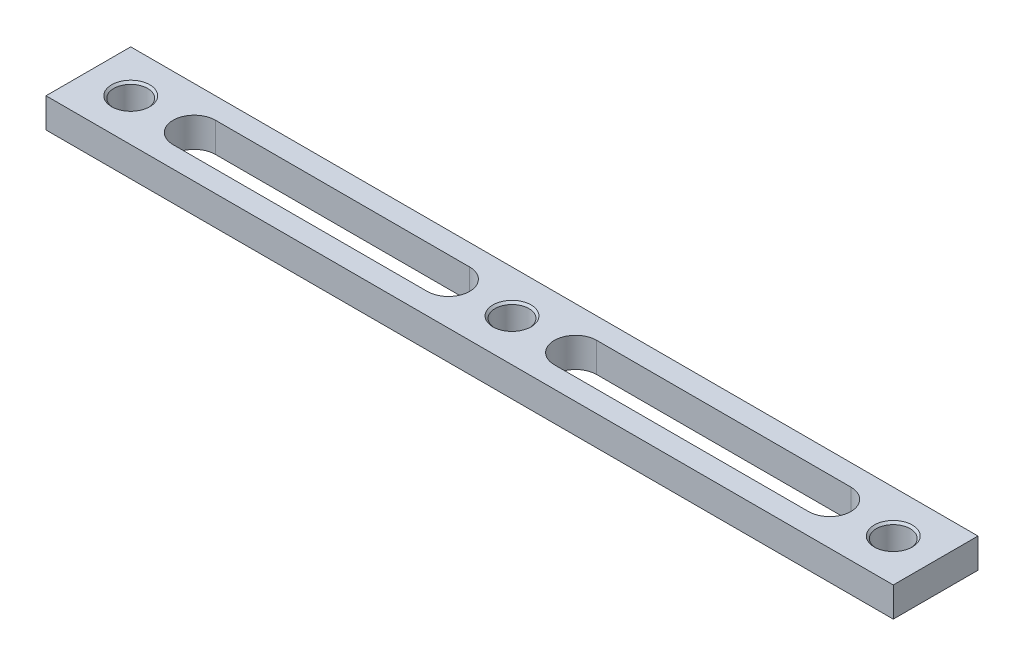
ISO-10303-21;
HEADER;
FILE_DESCRIPTION(('STEP AP214'),'2;1');
FILE_NAME('part.step','',(''),(''),'','','');
FILE_SCHEMA(('AUTOMOTIVE_DESIGN { 1 0 10303 214 1 1 1 1 }'));
ENDSEC;
DATA;
#1=APPLICATION_CONTEXT('core data for automotive mechanical design processes');
#2=APPLICATION_PROTOCOL_DEFINITION('international standard','automotive_design',2000,#1);
#3=PRODUCT_CONTEXT('',#1,'mechanical');
#4=PRODUCT('Part','Part','',(#3));
#5=PRODUCT_RELATED_PRODUCT_CATEGORY('part','',(#4));
#6=PRODUCT_DEFINITION_FORMATION('','',#4);
#7=PRODUCT_DEFINITION_CONTEXT('part definition',#1,'design');
#8=PRODUCT_DEFINITION('design','',#6,#7);
#9=PRODUCT_DEFINITION_SHAPE('','',#8);
#10=(LENGTH_UNIT() NAMED_UNIT(*) SI_UNIT(.MILLI.,.METRE.));
#11=(NAMED_UNIT(*) PLANE_ANGLE_UNIT() SI_UNIT($,.RADIAN.));
#12=(NAMED_UNIT(*) SI_UNIT($,.STERADIAN.) SOLID_ANGLE_UNIT());
#13=UNCERTAINTY_MEASURE_WITH_UNIT(LENGTH_MEASURE(1.E-05),#10,'distance_accuracy_value','');
#14=(GEOMETRIC_REPRESENTATION_CONTEXT(3) GLOBAL_UNCERTAINTY_ASSIGNED_CONTEXT((#13)) GLOBAL_UNIT_ASSIGNED_CONTEXT((#10,
#11,#12)) REPRESENTATION_CONTEXT('',''));
#15=CARTESIAN_POINT('',(0.,0.,0.));
#16=DIRECTION('',(0.,0.,1.));
#17=DIRECTION('',(1.,0.,0.));
#18=AXIS2_PLACEMENT_3D('',#15,#16,#17);
#19=CARTESIAN_POINT('',(0.,7.,0.));
#20=DIRECTION('',(0.,-1.,0.));
#21=DIRECTION('',(0.,0.,-1.));
#22=AXIS2_PLACEMENT_3D('',#19,#20,#21);
#23=PLANE('',#22);
#24=CARTESIAN_POINT('',(-75.,7.,0.));
#25=DIRECTION('',(0.,1.,0.));
#26=DIRECTION('',(0.,0.,1.));
#27=AXIS2_PLACEMENT_3D('',#24,#25,#26);
#28=CIRCLE('',#27,5.);
#29=CARTESIAN_POINT('',(-75.,7.,-5.));
#30=VERTEX_POINT('',#29);
#31=CARTESIAN_POINT('',(-75.,7.,5.));
#32=VERTEX_POINT('',#31);
#33=EDGE_CURVE('E184',#30,#32,#28,.T.);
#34=ORIENTED_EDGE('',*,*,#33,.F.);
#35=DIRECTION('',(-1.,0.,0.));
#36=VECTOR('',#35,1.);
#37=CARTESIAN_POINT('',(-75.,7.,-5.));
#38=LINE('',#37,#36);
#39=CARTESIAN_POINT('',(-15.,7.,-5.));
#40=VERTEX_POINT('',#39);
#41=EDGE_CURVE('E195',#40,#30,#38,.T.);
#42=ORIENTED_EDGE('',*,*,#41,.F.);
#43=CARTESIAN_POINT('',(-15.,7.,0.));
#44=DIRECTION('',(0.,1.,0.));
#45=DIRECTION('',(0.,0.,1.));
#46=AXIS2_PLACEMENT_3D('',#43,#44,#45);
#47=CIRCLE('',#46,5.);
#48=CARTESIAN_POINT('',(-15.,7.,5.));
#49=VERTEX_POINT('',#48);
#50=EDGE_CURVE('E191',#49,#40,#47,.T.);
#51=ORIENTED_EDGE('',*,*,#50,.F.);
#52=DIRECTION('',(1.,0.,0.));
#53=VECTOR('',#52,1.);
#54=CARTESIAN_POINT('',(-75.,7.,5.));
#55=LINE('',#54,#53);
#56=EDGE_CURVE('E187',#32,#49,#55,.T.);
#57=ORIENTED_EDGE('',*,*,#56,.F.);
#58=EDGE_LOOP('',(#34,#42,#51,#57));
#59=FACE_BOUND('',#58,.T.);
#60=DIRECTION('',(0.,0.,-1.));
#61=VECTOR('',#60,1.);
#62=CARTESIAN_POINT('',(100.,7.,10.));
#63=LINE('',#62,#61);
#64=CARTESIAN_POINT('',(100.,7.,10.));
#65=VERTEX_POINT('',#64);
#66=CARTESIAN_POINT('',(100.,7.,-10.));
#67=VERTEX_POINT('',#66);
#68=EDGE_CURVE('E227',#65,#67,#63,.T.);
#69=ORIENTED_EDGE('',*,*,#68,.T.);
#70=DIRECTION('',(-1.,0.,0.));
#71=VECTOR('',#70,1.);
#72=CARTESIAN_POINT('',(-100.,7.,-10.));
#73=LINE('',#72,#71);
#74=CARTESIAN_POINT('',(-100.,7.,-10.));
#75=VERTEX_POINT('',#74);
#76=EDGE_CURVE('E231',#67,#75,#73,.T.);
#77=ORIENTED_EDGE('',*,*,#76,.T.);
#78=DIRECTION('',(0.,0.,1.));
#79=VECTOR('',#78,1.);
#80=CARTESIAN_POINT('',(-100.,7.,10.));
#81=LINE('',#80,#79);
#82=CARTESIAN_POINT('',(-100.,7.,10.));
#83=VERTEX_POINT('',#82);
#84=EDGE_CURVE('E235',#75,#83,#81,.T.);
#85=ORIENTED_EDGE('',*,*,#84,.T.);
#86=DIRECTION('',(1.,0.,0.));
#87=VECTOR('',#86,1.);
#88=CARTESIAN_POINT('',(-100.,7.,10.));
#89=LINE('',#88,#87);
#90=EDGE_CURVE('E238',#83,#65,#89,.T.);
#91=ORIENTED_EDGE('',*,*,#90,.T.);
#92=EDGE_LOOP('',(#69,#77,#85,#91));
#93=FACE_BOUND('',#92,.T.);
#94=CARTESIAN_POINT('',(75.,7.,0.));
#95=DIRECTION('',(0.,1.,0.));
#96=DIRECTION('',(0.,0.,-1.));
#97=AXIS2_PLACEMENT_3D('',#94,#95,#96);
#98=CIRCLE('',#97,5.);
#99=CARTESIAN_POINT('',(75.,7.,5.));
#100=VERTEX_POINT('',#99);
#101=CARTESIAN_POINT('',(75.,7.,-5.));
#102=VERTEX_POINT('',#101);
#103=EDGE_CURVE('E133',#100,#102,#98,.T.);
#104=ORIENTED_EDGE('',*,*,#103,.F.);
#105=DIRECTION('',(1.,0.,0.));
#106=VECTOR('',#105,1.);
#107=CARTESIAN_POINT('',(75.,7.,5.));
#108=LINE('',#107,#106);
#109=CARTESIAN_POINT('',(15.,7.,5.));
#110=VERTEX_POINT('',#109);
#111=EDGE_CURVE('E160',#110,#100,#108,.T.);
#112=ORIENTED_EDGE('',*,*,#111,.F.);
#113=CARTESIAN_POINT('',(15.,7.,0.));
#114=DIRECTION('',(0.,1.,0.));
#115=DIRECTION('',(0.,0.,-1.));
#116=AXIS2_PLACEMENT_3D('',#113,#114,#115);
#117=CIRCLE('',#116,5.);
#118=CARTESIAN_POINT('',(15.,7.,-5.));
#119=VERTEX_POINT('',#118);
#120=EDGE_CURVE('E156',#119,#110,#117,.T.);
#121=ORIENTED_EDGE('',*,*,#120,.F.);
#122=DIRECTION('',(-1.,0.,0.));
#123=VECTOR('',#122,1.);
#124=CARTESIAN_POINT('',(75.,7.,-5.));
#125=LINE('',#124,#123);
#126=EDGE_CURVE('E142',#102,#119,#125,.T.);
#127=ORIENTED_EDGE('',*,*,#126,.F.);
#128=EDGE_LOOP('',(#104,#112,#121,#127));
#129=FACE_BOUND('',#128,.T.);
#130=CARTESIAN_POINT('',(90.,7.,0.));
#131=DIRECTION('',(0.,1.,0.));
#132=DIRECTION('',(0.,0.,1.));
#133=AXIS2_PLACEMENT_3D('',#130,#131,#132);
#134=CIRCLE('',#133,4.5);
#135=CARTESIAN_POINT('',(90.,7.,4.5));
#136=VERTEX_POINT('',#135);
#137=EDGE_CURVE('E420',#136,#136,#134,.T.);
#138=ORIENTED_EDGE('',*,*,#137,.F.);
#139=EDGE_LOOP('',(#138));
#140=FACE_BOUND('',#139,.T.);
#141=CARTESIAN_POINT('',(0.,7.,0.));
#142=DIRECTION('',(0.,1.,0.));
#143=DIRECTION('',(0.,0.,1.));
#144=AXIS2_PLACEMENT_3D('',#141,#142,#143);
#145=CIRCLE('',#144,4.5);
#146=CARTESIAN_POINT('',(0.,7.,4.5));
#147=VERTEX_POINT('',#146);
#148=EDGE_CURVE('E404',#147,#147,#145,.T.);
#149=ORIENTED_EDGE('',*,*,#148,.F.);
#150=EDGE_LOOP('',(#149));
#151=FACE_BOUND('',#150,.T.);
#152=CARTESIAN_POINT('',(-90.,7.,0.));
#153=DIRECTION('',(0.,1.,0.));
#154=DIRECTION('',(0.,0.,1.));
#155=AXIS2_PLACEMENT_3D('',#152,#153,#154);
#156=CIRCLE('',#155,4.5);
#157=CARTESIAN_POINT('',(-90.,7.,4.5));
#158=VERTEX_POINT('',#157);
#159=EDGE_CURVE('E385',#158,#158,#156,.T.);
#160=ORIENTED_EDGE('',*,*,#159,.F.);
#161=EDGE_LOOP('',(#160));
#162=FACE_BOUND('',#161,.T.);
#163=ADVANCED_FACE('F43',(#59,#93,#129,#140,#151,#162),#23,.F.);
#164=CARTESIAN_POINT('',(0.,0.,0.));
#165=DIRECTION('',(0.,-1.,0.));
#166=DIRECTION('',(0.,0.,-1.));
#167=AXIS2_PLACEMENT_3D('',#164,#165,#166);
#168=PLANE('',#167);
#169=CARTESIAN_POINT('',(-90.,0.,0.));
#170=DIRECTION('',(0.,1.,0.));
#171=DIRECTION('',(0.,0.,1.));
#172=AXIS2_PLACEMENT_3D('',#169,#170,#171);
#173=CIRCLE('',#172,4.5);
#174=CARTESIAN_POINT('',(-90.,0.,4.5));
#175=VERTEX_POINT('',#174);
#176=EDGE_CURVE('E388',#175,#175,#173,.T.);
#177=ORIENTED_EDGE('',*,*,#176,.T.);
#178=EDGE_LOOP('',(#177));
#179=FACE_BOUND('',#178,.T.);
#180=CARTESIAN_POINT('',(0.,0.,0.));
#181=DIRECTION('',(0.,1.,0.));
#182=DIRECTION('',(0.,0.,1.));
#183=AXIS2_PLACEMENT_3D('',#180,#181,#182);
#184=CIRCLE('',#183,4.5);
#185=CARTESIAN_POINT('',(0.,0.,4.5));
#186=VERTEX_POINT('',#185);
#187=EDGE_CURVE('E400',#186,#186,#184,.T.);
#188=ORIENTED_EDGE('',*,*,#187,.T.);
#189=EDGE_LOOP('',(#188));
#190=FACE_BOUND('',#189,.T.);
#191=CARTESIAN_POINT('',(90.,0.,0.));
#192=DIRECTION('',(0.,1.,0.));
#193=DIRECTION('',(0.,0.,1.));
#194=AXIS2_PLACEMENT_3D('',#191,#192,#193);
#195=CIRCLE('',#194,4.5);
#196=CARTESIAN_POINT('',(90.,0.,4.5));
#197=VERTEX_POINT('',#196);
#198=EDGE_CURVE('E416',#197,#197,#195,.T.);
#199=ORIENTED_EDGE('',*,*,#198,.T.);
#200=EDGE_LOOP('',(#199));
#201=FACE_BOUND('',#200,.T.);
#202=DIRECTION('',(0.,0.,-1.));
#203=VECTOR('',#202,1.);
#204=CARTESIAN_POINT('',(100.,0.,10.));
#205=LINE('',#204,#203);
#206=CARTESIAN_POINT('',(100.,0.,10.));
#207=VERTEX_POINT('',#206);
#208=CARTESIAN_POINT('',(100.,0.,-10.));
#209=VERTEX_POINT('',#208);
#210=EDGE_CURVE('E226',#207,#209,#205,.T.);
#211=ORIENTED_EDGE('',*,*,#210,.F.);
#212=DIRECTION('',(1.,0.,0.));
#213=VECTOR('',#212,1.);
#214=CARTESIAN_POINT('',(-100.,0.,10.));
#215=LINE('',#214,#213);
#216=CARTESIAN_POINT('',(-100.,0.,10.));
#217=VERTEX_POINT('',#216);
#218=EDGE_CURVE('E232',#217,#207,#215,.T.);
#219=ORIENTED_EDGE('',*,*,#218,.F.);
#220=DIRECTION('',(0.,0.,1.));
#221=VECTOR('',#220,1.);
#222=CARTESIAN_POINT('',(-100.,0.,10.));
#223=LINE('',#222,#221);
#224=CARTESIAN_POINT('',(-100.,0.,-10.));
#225=VERTEX_POINT('',#224);
#226=EDGE_CURVE('E248',#225,#217,#223,.T.);
#227=ORIENTED_EDGE('',*,*,#226,.F.);
#228=DIRECTION('',(-1.,0.,0.));
#229=VECTOR('',#228,1.);
#230=CARTESIAN_POINT('',(-100.,0.,-10.));
#231=LINE('',#230,#229);
#232=EDGE_CURVE('E245',#209,#225,#231,.T.);
#233=ORIENTED_EDGE('',*,*,#232,.F.);
#234=EDGE_LOOP('',(#211,#219,#227,#233));
#235=FACE_BOUND('',#234,.T.);
#236=DIRECTION('',(-1.,0.,0.));
#237=VECTOR('',#236,1.);
#238=CARTESIAN_POINT('',(-75.,0.,-5.));
#239=LINE('',#238,#237);
#240=CARTESIAN_POINT('',(-15.,0.,-5.));
#241=VERTEX_POINT('',#240);
#242=CARTESIAN_POINT('',(-75.,0.,-5.));
#243=VERTEX_POINT('',#242);
#244=EDGE_CURVE('E188',#241,#243,#239,.T.);
#245=ORIENTED_EDGE('',*,*,#244,.T.);
#246=CARTESIAN_POINT('',(-75.,0.,0.));
#247=DIRECTION('',(0.,1.,0.));
#248=DIRECTION('',(0.,0.,1.));
#249=AXIS2_PLACEMENT_3D('',#246,#247,#248);
#250=CIRCLE('',#249,5.);
#251=CARTESIAN_POINT('',(-75.,0.,5.));
#252=VERTEX_POINT('',#251);
#253=EDGE_CURVE('E151',#243,#252,#250,.T.);
#254=ORIENTED_EDGE('',*,*,#253,.T.);
#255=DIRECTION('',(1.,0.,0.));
#256=VECTOR('',#255,1.);
#257=CARTESIAN_POINT('',(-75.,0.,5.));
#258=LINE('',#257,#256);
#259=CARTESIAN_POINT('',(-15.,0.,5.));
#260=VERTEX_POINT('',#259);
#261=EDGE_CURVE('E202',#252,#260,#258,.T.);
#262=ORIENTED_EDGE('',*,*,#261,.T.);
#263=CARTESIAN_POINT('',(-15.,0.,0.));
#264=DIRECTION('',(0.,1.,0.));
#265=DIRECTION('',(0.,0.,1.));
#266=AXIS2_PLACEMENT_3D('',#263,#264,#265);
#267=CIRCLE('',#266,5.);
#268=EDGE_CURVE('E206',#260,#241,#267,.T.);
#269=ORIENTED_EDGE('',*,*,#268,.T.);
#270=EDGE_LOOP('',(#245,#254,#262,#269));
#271=FACE_BOUND('',#270,.T.);
#272=DIRECTION('',(1.,0.,0.));
#273=VECTOR('',#272,1.);
#274=CARTESIAN_POINT('',(75.,0.,5.));
#275=LINE('',#274,#273);
#276=CARTESIAN_POINT('',(15.,0.,5.));
#277=VERTEX_POINT('',#276);
#278=CARTESIAN_POINT('',(75.,0.,5.));
#279=VERTEX_POINT('',#278);
#280=EDGE_CURVE('E143',#277,#279,#275,.T.);
#281=ORIENTED_EDGE('',*,*,#280,.T.);
#282=CARTESIAN_POINT('',(75.,0.,0.));
#283=DIRECTION('',(0.,1.,0.));
#284=DIRECTION('',(0.,0.,-1.));
#285=AXIS2_PLACEMENT_3D('',#282,#283,#284);
#286=CIRCLE('',#285,5.);
#287=CARTESIAN_POINT('',(75.,0.,-5.));
#288=VERTEX_POINT('',#287);
#289=EDGE_CURVE('E67',#279,#288,#286,.T.);
#290=ORIENTED_EDGE('',*,*,#289,.T.);
#291=DIRECTION('',(-1.,0.,0.));
#292=VECTOR('',#291,1.);
#293=CARTESIAN_POINT('',(75.,0.,-5.));
#294=LINE('',#293,#292);
#295=CARTESIAN_POINT('',(15.,0.,-5.));
#296=VERTEX_POINT('',#295);
#297=EDGE_CURVE('E149',#288,#296,#294,.T.);
#298=ORIENTED_EDGE('',*,*,#297,.T.);
#299=CARTESIAN_POINT('',(15.,0.,0.));
#300=DIRECTION('',(0.,1.,0.));
#301=DIRECTION('',(0.,0.,-1.));
#302=AXIS2_PLACEMENT_3D('',#299,#300,#301);
#303=CIRCLE('',#302,5.);
#304=EDGE_CURVE('E171',#296,#277,#303,.T.);
#305=ORIENTED_EDGE('',*,*,#304,.T.);
#306=EDGE_LOOP('',(#281,#290,#298,#305));
#307=FACE_BOUND('',#306,.T.);
#308=ADVANCED_FACE('F271',(#179,#190,#201,#235,#271,#307),#168,.T.);
#309=CARTESIAN_POINT('',(100.,7.,10.));
#310=DIRECTION('',(-1.,0.,0.));
#311=DIRECTION('',(0.,0.,1.));
#312=AXIS2_PLACEMENT_3D('',#309,#310,#311);
#313=PLANE('',#312);
#314=ORIENTED_EDGE('',*,*,#210,.T.);
#315=DIRECTION('',(0.,-1.,0.));
#316=VECTOR('',#315,1.);
#317=CARTESIAN_POINT('',(100.,7.,-10.));
#318=LINE('',#317,#316);
#319=EDGE_CURVE('E11',#67,#209,#318,.T.);
#320=ORIENTED_EDGE('',*,*,#319,.F.);
#321=ORIENTED_EDGE('',*,*,#68,.F.);
#322=DIRECTION('',(0.,-1.,0.));
#323=VECTOR('',#322,1.);
#324=CARTESIAN_POINT('',(100.,7.,10.));
#325=LINE('',#324,#323);
#326=EDGE_CURVE('E241',#65,#207,#325,.T.);
#327=ORIENTED_EDGE('',*,*,#326,.T.);
#328=EDGE_LOOP('',(#314,#320,#321,#327));
#329=FACE_BOUND('',#328,.T.);
#330=ADVANCED_FACE('F45',(#329),#313,.F.);
#331=CARTESIAN_POINT('',(-100.,7.,-10.));
#332=DIRECTION('',(0.,0.,1.));
#333=DIRECTION('',(1.,0.,0.));
#334=AXIS2_PLACEMENT_3D('',#331,#332,#333);
#335=PLANE('',#334);
#336=ORIENTED_EDGE('',*,*,#232,.T.);
#337=DIRECTION('',(0.,-1.,0.));
#338=VECTOR('',#337,1.);
#339=CARTESIAN_POINT('',(-100.,7.,-10.));
#340=LINE('',#339,#338);
#341=EDGE_CURVE('E52',#75,#225,#340,.T.);
#342=ORIENTED_EDGE('',*,*,#341,.F.);
#343=ORIENTED_EDGE('',*,*,#76,.F.);
#344=ORIENTED_EDGE('',*,*,#319,.T.);
#345=EDGE_LOOP('',(#336,#342,#343,#344));
#346=FACE_BOUND('',#345,.T.);
#347=ADVANCED_FACE('F281',(#346),#335,.F.);
#348=CARTESIAN_POINT('',(-100.,7.,10.));
#349=DIRECTION('',(1.,0.,0.));
#350=DIRECTION('',(0.,0.,-1.));
#351=AXIS2_PLACEMENT_3D('',#348,#349,#350);
#352=PLANE('',#351);
#353=ORIENTED_EDGE('',*,*,#226,.T.);
#354=DIRECTION('',(0.,-1.,0.));
#355=VECTOR('',#354,1.);
#356=CARTESIAN_POINT('',(-100.,7.,10.));
#357=LINE('',#356,#355);
#358=EDGE_CURVE('E256',#83,#217,#357,.T.);
#359=ORIENTED_EDGE('',*,*,#358,.F.);
#360=ORIENTED_EDGE('',*,*,#84,.F.);
#361=ORIENTED_EDGE('',*,*,#341,.T.);
#362=EDGE_LOOP('',(#353,#359,#360,#361));
#363=FACE_BOUND('',#362,.T.);
#364=ADVANCED_FACE('F265',(#363),#352,.F.);
#365=CARTESIAN_POINT('',(-100.,7.,10.));
#366=DIRECTION('',(0.,0.,-1.));
#367=DIRECTION('',(-1.,0.,0.));
#368=AXIS2_PLACEMENT_3D('',#365,#366,#367);
#369=PLANE('',#368);
#370=ORIENTED_EDGE('',*,*,#218,.T.);
#371=ORIENTED_EDGE('',*,*,#326,.F.);
#372=ORIENTED_EDGE('',*,*,#90,.F.);
#373=ORIENTED_EDGE('',*,*,#358,.T.);
#374=EDGE_LOOP('',(#370,#371,#372,#373));
#375=FACE_BOUND('',#374,.T.);
#376=ADVANCED_FACE('F275',(#375),#369,.F.);
#377=CARTESIAN_POINT('',(-75.,7.,0.));
#378=DIRECTION('',(0.,-1.,0.));
#379=DIRECTION('',(0.,0.,-1.));
#380=AXIS2_PLACEMENT_3D('',#377,#378,#379);
#381=CYLINDRICAL_SURFACE('',#380,5.);
#382=ORIENTED_EDGE('',*,*,#253,.F.);
#383=DIRECTION('',(0.,-1.,0.));
#384=VECTOR('',#383,1.);
#385=CARTESIAN_POINT('',(-75.,7.,-5.));
#386=LINE('',#385,#384);
#387=EDGE_CURVE('E198',#30,#243,#386,.T.);
#388=ORIENTED_EDGE('',*,*,#387,.F.);
#389=ORIENTED_EDGE('',*,*,#33,.T.);
#390=DIRECTION('',(0.,-1.,0.));
#391=VECTOR('',#390,1.);
#392=CARTESIAN_POINT('',(-75.,7.,5.));
#393=LINE('',#392,#391);
#394=EDGE_CURVE('E222',#32,#252,#393,.T.);
#395=ORIENTED_EDGE('',*,*,#394,.T.);
#396=EDGE_LOOP('',(#382,#388,#389,#395));
#397=FACE_BOUND('',#396,.T.);
#398=ADVANCED_FACE('F298',(#397),#381,.F.);
#399=CARTESIAN_POINT('',(-75.,7.,5.));
#400=DIRECTION('',(0.,0.,-1.));
#401=DIRECTION('',(-1.,0.,0.));
#402=AXIS2_PLACEMENT_3D('',#399,#400,#401);
#403=PLANE('',#402);
#404=ORIENTED_EDGE('',*,*,#261,.F.);
#405=ORIENTED_EDGE('',*,*,#394,.F.);
#406=ORIENTED_EDGE('',*,*,#56,.T.);
#407=DIRECTION('',(0.,-1.,0.));
#408=VECTOR('',#407,1.);
#409=CARTESIAN_POINT('',(-15.,7.,5.));
#410=LINE('',#409,#408);
#411=EDGE_CURVE('E219',#49,#260,#410,.T.);
#412=ORIENTED_EDGE('',*,*,#411,.T.);
#413=EDGE_LOOP('',(#404,#405,#406,#412));
#414=FACE_BOUND('',#413,.T.);
#415=ADVANCED_FACE('F305',(#414),#403,.T.);
#416=CARTESIAN_POINT('',(-15.,7.,0.));
#417=DIRECTION('',(0.,-1.,0.));
#418=DIRECTION('',(0.,0.,-1.));
#419=AXIS2_PLACEMENT_3D('',#416,#417,#418);
#420=CYLINDRICAL_SURFACE('',#419,5.);
#421=ORIENTED_EDGE('',*,*,#268,.F.);
#422=ORIENTED_EDGE('',*,*,#411,.F.);
#423=ORIENTED_EDGE('',*,*,#50,.T.);
#424=DIRECTION('',(0.,-1.,0.));
#425=VECTOR('',#424,1.);
#426=CARTESIAN_POINT('',(-15.,7.,-5.));
#427=LINE('',#426,#425);
#428=EDGE_CURVE('E216',#40,#241,#427,.T.);
#429=ORIENTED_EDGE('',*,*,#428,.T.);
#430=EDGE_LOOP('',(#421,#422,#423,#429));
#431=FACE_BOUND('',#430,.T.);
#432=ADVANCED_FACE('F310',(#431),#420,.F.);
#433=CARTESIAN_POINT('',(-75.,7.,-5.));
#434=DIRECTION('',(0.,0.,1.));
#435=DIRECTION('',(1.,0.,0.));
#436=AXIS2_PLACEMENT_3D('',#433,#434,#435);
#437=PLANE('',#436);
#438=ORIENTED_EDGE('',*,*,#244,.F.);
#439=ORIENTED_EDGE('',*,*,#428,.F.);
#440=ORIENTED_EDGE('',*,*,#41,.T.);
#441=ORIENTED_EDGE('',*,*,#387,.T.);
#442=EDGE_LOOP('',(#438,#439,#440,#441));
#443=FACE_BOUND('',#442,.T.);
#444=ADVANCED_FACE('F316',(#443),#437,.T.);
#445=CARTESIAN_POINT('',(75.,7.,0.));
#446=DIRECTION('',(0.,-1.,0.));
#447=DIRECTION('',(0.,0.,-1.));
#448=AXIS2_PLACEMENT_3D('',#445,#446,#447);
#449=CYLINDRICAL_SURFACE('',#448,5.);
#450=ORIENTED_EDGE('',*,*,#289,.F.);
#451=DIRECTION('',(0.,-1.,0.));
#452=VECTOR('',#451,1.);
#453=CARTESIAN_POINT('',(75.,7.,5.));
#454=LINE('',#453,#452);
#455=EDGE_CURVE('E137',#100,#279,#454,.T.);
#456=ORIENTED_EDGE('',*,*,#455,.F.);
#457=ORIENTED_EDGE('',*,*,#103,.T.);
#458=DIRECTION('',(0.,-1.,0.));
#459=VECTOR('',#458,1.);
#460=CARTESIAN_POINT('',(75.,7.,-5.));
#461=LINE('',#460,#459);
#462=EDGE_CURVE('E136',#102,#288,#461,.T.);
#463=ORIENTED_EDGE('',*,*,#462,.T.);
#464=EDGE_LOOP('',(#450,#456,#457,#463));
#465=FACE_BOUND('',#464,.T.);
#466=ADVANCED_FACE('F135',(#465),#449,.F.);
#467=CARTESIAN_POINT('',(75.,7.,-5.));
#468=DIRECTION('',(0.,0.,1.));
#469=DIRECTION('',(1.,0.,0.));
#470=AXIS2_PLACEMENT_3D('',#467,#468,#469);
#471=PLANE('',#470);
#472=ORIENTED_EDGE('',*,*,#297,.F.);
#473=ORIENTED_EDGE('',*,*,#462,.F.);
#474=ORIENTED_EDGE('',*,*,#126,.T.);
#475=DIRECTION('',(0.,-1.,0.));
#476=VECTOR('',#475,1.);
#477=CARTESIAN_POINT('',(15.,7.,-5.));
#478=LINE('',#477,#476);
#479=EDGE_CURVE('E152',#119,#296,#478,.T.);
#480=ORIENTED_EDGE('',*,*,#479,.T.);
#481=EDGE_LOOP('',(#472,#473,#474,#480));
#482=FACE_BOUND('',#481,.T.);
#483=ADVANCED_FACE('F146',(#482),#471,.T.);
#484=CARTESIAN_POINT('',(15.,7.,0.));
#485=DIRECTION('',(0.,-1.,0.));
#486=DIRECTION('',(0.,0.,-1.));
#487=AXIS2_PLACEMENT_3D('',#484,#485,#486);
#488=CYLINDRICAL_SURFACE('',#487,5.);
#489=ORIENTED_EDGE('',*,*,#304,.F.);
#490=ORIENTED_EDGE('',*,*,#479,.F.);
#491=ORIENTED_EDGE('',*,*,#120,.T.);
#492=DIRECTION('',(0.,-1.,0.));
#493=VECTOR('',#492,1.);
#494=CARTESIAN_POINT('',(15.,7.,5.));
#495=LINE('',#494,#493);
#496=EDGE_CURVE('E59',#110,#277,#495,.T.);
#497=ORIENTED_EDGE('',*,*,#496,.T.);
#498=EDGE_LOOP('',(#489,#490,#491,#497));
#499=FACE_BOUND('',#498,.T.);
#500=ADVANCED_FACE('F335',(#499),#488,.F.);
#501=CARTESIAN_POINT('',(75.,7.,5.));
#502=DIRECTION('',(0.,0.,-1.));
#503=DIRECTION('',(-1.,0.,0.));
#504=AXIS2_PLACEMENT_3D('',#501,#502,#503);
#505=PLANE('',#504);
#506=ORIENTED_EDGE('',*,*,#280,.F.);
#507=ORIENTED_EDGE('',*,*,#496,.F.);
#508=ORIENTED_EDGE('',*,*,#111,.T.);
#509=ORIENTED_EDGE('',*,*,#455,.T.);
#510=EDGE_LOOP('',(#506,#507,#508,#509));
#511=FACE_BOUND('',#510,.T.);
#512=ADVANCED_FACE('F338',(#511),#505,.T.);
#513=CARTESIAN_POINT('',(90.,0.500000000000003,0.));
#514=DIRECTION('',(0.,-1.,0.));
#515=DIRECTION('',(0.,0.,-1.));
#516=AXIS2_PLACEMENT_3D('',#513,#514,#515);
#517=CONICAL_SURFACE('',#516,4.,0.785398163397447);
#518=ORIENTED_EDGE('',*,*,#198,.F.);
#519=EDGE_LOOP('',(#518));
#520=FACE_BOUND('',#519,.T.);
#521=CARTESIAN_POINT('',(90.,0.500000000000003,0.));
#522=DIRECTION('',(0.,1.,0.));
#523=DIRECTION('',(0.,0.,1.));
#524=AXIS2_PLACEMENT_3D('',#521,#522,#523);
#525=CIRCLE('',#524,4.);
#526=CARTESIAN_POINT('',(90.,0.500000000000003,4.));
#527=VERTEX_POINT('',#526);
#528=EDGE_CURVE('E168',#527,#527,#525,.T.);
#529=ORIENTED_EDGE('',*,*,#528,.T.);
#530=EDGE_LOOP('',(#529));
#531=FACE_BOUND('',#530,.T.);
#532=ADVANCED_FACE('F342',(#520,#531),#517,.F.);
#533=CARTESIAN_POINT('',(90.,7.,0.));
#534=DIRECTION('',(0.,1.,0.));
#535=DIRECTION('',(0.,0.,1.));
#536=AXIS2_PLACEMENT_3D('',#533,#534,#535);
#537=CYLINDRICAL_SURFACE('',#536,4.);
#538=ORIENTED_EDGE('',*,*,#528,.F.);
#539=EDGE_LOOP('',(#538));
#540=FACE_BOUND('',#539,.T.);
#541=CARTESIAN_POINT('',(90.,6.5,0.));
#542=DIRECTION('',(0.,1.,0.));
#543=DIRECTION('',(0.,0.,1.));
#544=AXIS2_PLACEMENT_3D('',#541,#542,#543);
#545=CIRCLE('',#544,4.);
#546=CARTESIAN_POINT('',(90.,6.5,4.));
#547=VERTEX_POINT('',#546);
#548=EDGE_CURVE('E424',#547,#547,#545,.T.);
#549=ORIENTED_EDGE('',*,*,#548,.T.);
#550=EDGE_LOOP('',(#549));
#551=FACE_BOUND('',#550,.T.);
#552=ADVANCED_FACE('F345',(#540,#551),#537,.F.);
#553=CARTESIAN_POINT('',(90.,7.,0.));
#554=DIRECTION('',(0.,1.,0.));
#555=DIRECTION('',(0.,0.,1.));
#556=AXIS2_PLACEMENT_3D('',#553,#554,#555);
#557=CONICAL_SURFACE('',#556,4.5,0.785398163397448);
#558=ORIENTED_EDGE('',*,*,#548,.F.);
#559=EDGE_LOOP('',(#558));
#560=FACE_BOUND('',#559,.T.);
#561=ORIENTED_EDGE('',*,*,#137,.T.);
#562=EDGE_LOOP('',(#561));
#563=FACE_BOUND('',#562,.T.);
#564=ADVANCED_FACE('F349',(#560,#563),#557,.F.);
#565=CARTESIAN_POINT('',(0.,0.500000000000003,0.));
#566=DIRECTION('',(0.,-1.,0.));
#567=DIRECTION('',(0.,0.,-1.));
#568=AXIS2_PLACEMENT_3D('',#565,#566,#567);
#569=CONICAL_SURFACE('',#568,4.,0.785398163397447);
#570=ORIENTED_EDGE('',*,*,#187,.F.);
#571=EDGE_LOOP('',(#570));
#572=FACE_BOUND('',#571,.T.);
#573=CARTESIAN_POINT('',(0.,0.500000000000003,0.));
#574=DIRECTION('',(0.,1.,0.));
#575=DIRECTION('',(0.,0.,1.));
#576=AXIS2_PLACEMENT_3D('',#573,#574,#575);
#577=CIRCLE('',#576,4.);
#578=CARTESIAN_POINT('',(0.,0.500000000000003,4.));
#579=VERTEX_POINT('',#578);
#580=EDGE_CURVE('E412',#579,#579,#577,.T.);
#581=ORIENTED_EDGE('',*,*,#580,.T.);
#582=EDGE_LOOP('',(#581));
#583=FACE_BOUND('',#582,.T.);
#584=ADVANCED_FACE('F353',(#572,#583),#569,.F.);
#585=CARTESIAN_POINT('',(0.,7.,0.));
#586=DIRECTION('',(0.,1.,0.));
#587=DIRECTION('',(0.,0.,1.));
#588=AXIS2_PLACEMENT_3D('',#585,#586,#587);
#589=CYLINDRICAL_SURFACE('',#588,4.);
#590=ORIENTED_EDGE('',*,*,#580,.F.);
#591=EDGE_LOOP('',(#590));
#592=FACE_BOUND('',#591,.T.);
#593=CARTESIAN_POINT('',(0.,6.5,0.));
#594=DIRECTION('',(0.,1.,0.));
#595=DIRECTION('',(0.,0.,1.));
#596=AXIS2_PLACEMENT_3D('',#593,#594,#595);
#597=CIRCLE('',#596,4.);
#598=CARTESIAN_POINT('',(0.,6.5,4.));
#599=VERTEX_POINT('',#598);
#600=EDGE_CURVE('E408',#599,#599,#597,.T.);
#601=ORIENTED_EDGE('',*,*,#600,.T.);
#602=EDGE_LOOP('',(#601));
#603=FACE_BOUND('',#602,.T.);
#604=ADVANCED_FACE('F357',(#592,#603),#589,.F.);
#605=CARTESIAN_POINT('',(0.,7.,0.));
#606=DIRECTION('',(0.,1.,0.));
#607=DIRECTION('',(0.,0.,1.));
#608=AXIS2_PLACEMENT_3D('',#605,#606,#607);
#609=CONICAL_SURFACE('',#608,4.5,0.78539816339745);
#610=ORIENTED_EDGE('',*,*,#600,.F.);
#611=EDGE_LOOP('',(#610));
#612=FACE_BOUND('',#611,.T.);
#613=ORIENTED_EDGE('',*,*,#148,.T.);
#614=EDGE_LOOP('',(#613));
#615=FACE_BOUND('',#614,.T.);
#616=ADVANCED_FACE('F361',(#612,#615),#609,.F.);
#617=CARTESIAN_POINT('',(-90.,0.500000000000003,0.));
#618=DIRECTION('',(0.,-1.,0.));
#619=DIRECTION('',(0.,0.,-1.));
#620=AXIS2_PLACEMENT_3D('',#617,#618,#619);
#621=CONICAL_SURFACE('',#620,4.,0.785398163397447);
#622=ORIENTED_EDGE('',*,*,#176,.F.);
#623=EDGE_LOOP('',(#622));
#624=FACE_BOUND('',#623,.T.);
#625=CARTESIAN_POINT('',(-90.,0.500000000000003,0.));
#626=DIRECTION('',(0.,1.,0.));
#627=DIRECTION('',(0.,0.,1.));
#628=AXIS2_PLACEMENT_3D('',#625,#626,#627);
#629=CIRCLE('',#628,4.);
#630=CARTESIAN_POINT('',(-90.,0.500000000000003,4.));
#631=VERTEX_POINT('',#630);
#632=EDGE_CURVE('E392',#631,#631,#629,.T.);
#633=ORIENTED_EDGE('',*,*,#632,.T.);
#634=EDGE_LOOP('',(#633));
#635=FACE_BOUND('',#634,.T.);
#636=ADVANCED_FACE('F365',(#624,#635),#621,.F.);
#637=CARTESIAN_POINT('',(-90.,7.,0.));
#638=DIRECTION('',(0.,1.,0.));
#639=DIRECTION('',(0.,0.,1.));
#640=AXIS2_PLACEMENT_3D('',#637,#638,#639);
#641=CYLINDRICAL_SURFACE('',#640,4.);
#642=ORIENTED_EDGE('',*,*,#632,.F.);
#643=EDGE_LOOP('',(#642));
#644=FACE_BOUND('',#643,.T.);
#645=CARTESIAN_POINT('',(-90.,6.5,0.));
#646=DIRECTION('',(0.,1.,0.));
#647=DIRECTION('',(0.,0.,1.));
#648=AXIS2_PLACEMENT_3D('',#645,#646,#647);
#649=CIRCLE('',#648,4.);
#650=CARTESIAN_POINT('',(-90.,6.5,4.));
#651=VERTEX_POINT('',#650);
#652=EDGE_CURVE('E382',#651,#651,#649,.T.);
#653=ORIENTED_EDGE('',*,*,#652,.T.);
#654=EDGE_LOOP('',(#653));
#655=FACE_BOUND('',#654,.T.);
#656=ADVANCED_FACE('F369',(#644,#655),#641,.F.);
#657=CARTESIAN_POINT('',(-90.,7.,0.));
#658=DIRECTION('',(0.,1.,0.));
#659=DIRECTION('',(0.,0.,1.));
#660=AXIS2_PLACEMENT_3D('',#657,#658,#659);
#661=CONICAL_SURFACE('',#660,4.5,0.785398163397448);
#662=ORIENTED_EDGE('',*,*,#652,.F.);
#663=EDGE_LOOP('',(#662));
#664=FACE_BOUND('',#663,.T.);
#665=ORIENTED_EDGE('',*,*,#159,.T.);
#666=EDGE_LOOP('',(#665));
#667=FACE_BOUND('',#666,.T.);
#668=ADVANCED_FACE('F373',(#664,#667),#661,.F.);
#669=CLOSED_SHELL('',(#163,#308,#330,#347,#364,#376,#398,#415,#432,#444,#466,#483,#500,#512,
#532,#552,#564,#584,#604,#616,#636,#656,#668));
#670=MANIFOLD_SOLID_BREP('B2',#669);
#671=ADVANCED_BREP_SHAPE_REPRESENTATION('',(#18,#670),#14);
#672=SHAPE_DEFINITION_REPRESENTATION(#9,#671);
ENDSEC;
END-ISO-10303-21;
